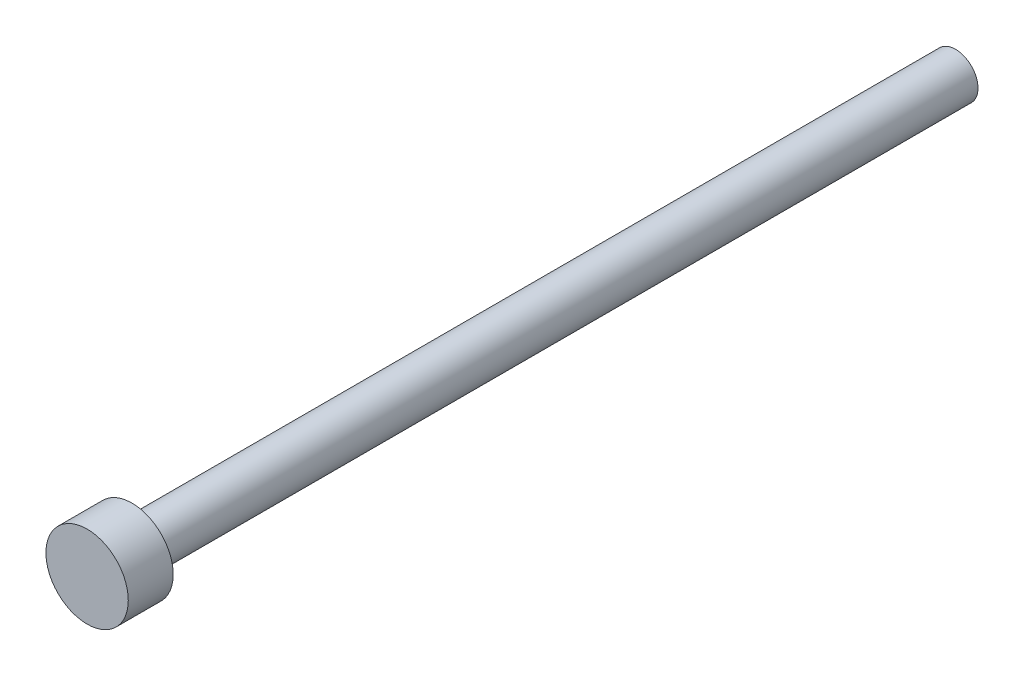
ISO-10303-21;
HEADER;
FILE_DESCRIPTION(('STEP AP214'),'2;1');
FILE_NAME('part.step','',(''),(''),'','','');
FILE_SCHEMA(('AUTOMOTIVE_DESIGN { 1 0 10303 214 1 1 1 1 }'));
ENDSEC;
DATA;
#1=APPLICATION_CONTEXT('core data for automotive mechanical design processes');
#2=APPLICATION_PROTOCOL_DEFINITION('international standard','automotive_design',2000,#1);
#3=PRODUCT_CONTEXT('',#1,'mechanical');
#4=PRODUCT('Part','Part','',(#3));
#5=PRODUCT_RELATED_PRODUCT_CATEGORY('part','',(#4));
#6=PRODUCT_DEFINITION_FORMATION('','',#4);
#7=PRODUCT_DEFINITION_CONTEXT('part definition',#1,'design');
#8=PRODUCT_DEFINITION('design','',#6,#7);
#9=PRODUCT_DEFINITION_SHAPE('','',#8);
#10=(LENGTH_UNIT() NAMED_UNIT(*) SI_UNIT(.MILLI.,.METRE.));
#11=(NAMED_UNIT(*) PLANE_ANGLE_UNIT() SI_UNIT($,.RADIAN.));
#12=(NAMED_UNIT(*) SI_UNIT($,.STERADIAN.) SOLID_ANGLE_UNIT());
#13=UNCERTAINTY_MEASURE_WITH_UNIT(LENGTH_MEASURE(1.E-05),#10,'distance_accuracy_value','');
#14=(GEOMETRIC_REPRESENTATION_CONTEXT(3) GLOBAL_UNCERTAINTY_ASSIGNED_CONTEXT((#13)) GLOBAL_UNIT_ASSIGNED_CONTEXT((#10,
#11,#12)) REPRESENTATION_CONTEXT('',''));
#15=CARTESIAN_POINT('',(0.,0.,0.));
#16=DIRECTION('',(0.,0.,1.));
#17=DIRECTION('',(1.,0.,0.));
#18=AXIS2_PLACEMENT_3D('',#15,#16,#17);
#19=CARTESIAN_POINT('',(0.,0.,0.));
#20=DIRECTION('',(0.,0.,-1.));
#21=DIRECTION('',(-1.,0.,0.));
#22=AXIS2_PLACEMENT_3D('',#19,#20,#21);
#23=CYLINDRICAL_SURFACE('',#22,1.5);
#24=CARTESIAN_POINT('',(0.,0.,0.));
#25=DIRECTION('',(0.,0.,1.));
#26=DIRECTION('',(1.,0.,0.));
#27=AXIS2_PLACEMENT_3D('',#24,#25,#26);
#28=CIRCLE('',#27,1.5);
#29=CARTESIAN_POINT('',(1.5,0.,0.));
#30=VERTEX_POINT('',#29);
#31=EDGE_CURVE('E10',#30,#30,#28,.T.);
#32=ORIENTED_EDGE('',*,*,#31,.F.);
#33=EDGE_LOOP('',(#32));
#34=FACE_BOUND('',#33,.T.);
#35=CARTESIAN_POINT('',(0.,0.,-55.));
#36=DIRECTION('',(0.,0.,1.));
#37=DIRECTION('',(1.,0.,0.));
#38=AXIS2_PLACEMENT_3D('',#35,#36,#37);
#39=CIRCLE('',#38,1.5);
#40=CARTESIAN_POINT('',(1.5,0.,-55.));
#41=VERTEX_POINT('',#40);
#42=EDGE_CURVE('E37',#41,#41,#39,.T.);
#43=ORIENTED_EDGE('',*,*,#42,.T.);
#44=EDGE_LOOP('',(#43));
#45=FACE_BOUND('',#44,.T.);
#46=ADVANCED_FACE('F40',(#34,#45),#23,.T.);
#47=CARTESIAN_POINT('',(0.,0.,-55.));
#48=DIRECTION('',(0.,0.,1.));
#49=DIRECTION('',(1.,0.,0.));
#50=AXIS2_PLACEMENT_3D('',#47,#48,#49);
#51=PLANE('',#50);
#52=ORIENTED_EDGE('',*,*,#42,.F.);
#53=EDGE_LOOP('',(#52));
#54=FACE_BOUND('',#53,.T.);
#55=ADVANCED_FACE('F58',(#54),#51,.F.);
#56=CARTESIAN_POINT('',(0.,0.,3.));
#57=DIRECTION('',(0.,0.,-1.));
#58=DIRECTION('',(-1.,0.,0.));
#59=AXIS2_PLACEMENT_3D('',#56,#57,#58);
#60=CYLINDRICAL_SURFACE('',#59,2.75);
#61=CARTESIAN_POINT('',(0.,0.,3.));
#62=DIRECTION('',(0.,0.,1.));
#63=DIRECTION('',(1.,0.,0.));
#64=AXIS2_PLACEMENT_3D('',#61,#62,#63);
#65=CIRCLE('',#64,2.75);
#66=CARTESIAN_POINT('',(2.75,0.,3.));
#67=VERTEX_POINT('',#66);
#68=EDGE_CURVE('E50',#67,#67,#65,.T.);
#69=ORIENTED_EDGE('',*,*,#68,.F.);
#70=EDGE_LOOP('',(#69));
#71=FACE_BOUND('',#70,.T.);
#72=CARTESIAN_POINT('',(0.,0.,0.));
#73=DIRECTION('',(0.,0.,1.));
#74=DIRECTION('',(1.,0.,0.));
#75=AXIS2_PLACEMENT_3D('',#72,#73,#74);
#76=CIRCLE('',#75,2.75);
#77=CARTESIAN_POINT('',(2.75,0.,0.));
#78=VERTEX_POINT('',#77);
#79=EDGE_CURVE('E47',#78,#78,#76,.T.);
#80=ORIENTED_EDGE('',*,*,#79,.T.);
#81=EDGE_LOOP('',(#80));
#82=FACE_BOUND('',#81,.T.);
#83=ADVANCED_FACE('F60',(#71,#82),#60,.T.);
#84=CARTESIAN_POINT('',(0.,0.,3.));
#85=DIRECTION('',(0.,0.,1.));
#86=DIRECTION('',(1.,0.,0.));
#87=AXIS2_PLACEMENT_3D('',#84,#85,#86);
#88=PLANE('',#87);
#89=ORIENTED_EDGE('',*,*,#68,.T.);
#90=EDGE_LOOP('',(#89));
#91=FACE_BOUND('',#90,.T.);
#92=ADVANCED_FACE('F54',(#91),#88,.T.);
#93=CARTESIAN_POINT('',(0.,0.,0.));
#94=DIRECTION('',(0.,0.,1.));
#95=DIRECTION('',(1.,0.,0.));
#96=AXIS2_PLACEMENT_3D('',#93,#94,#95);
#97=PLANE('',#96);
#98=ORIENTED_EDGE('',*,*,#31,.T.);
#99=EDGE_LOOP('',(#98));
#100=FACE_BOUND('',#99,.T.);
#101=ORIENTED_EDGE('',*,*,#79,.F.);
#102=EDGE_LOOP('',(#101));
#103=FACE_BOUND('',#102,.T.);
#104=ADVANCED_FACE('F63',(#100,#103),#97,.F.);
#105=CLOSED_SHELL('',(#46,#55,#83,#92,#104));
#106=MANIFOLD_SOLID_BREP('B2',#105);
#107=ADVANCED_BREP_SHAPE_REPRESENTATION('',(#18,#106),#14);
#108=SHAPE_DEFINITION_REPRESENTATION(#9,#107);
ENDSEC;
END-ISO-10303-21;
